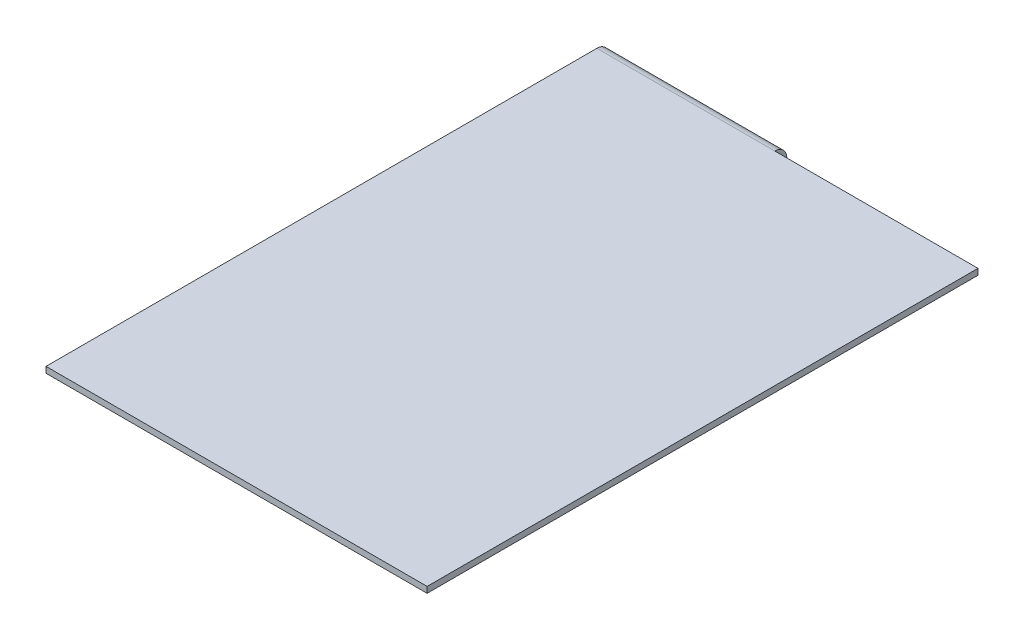
ISO-10303-21;
HEADER;
FILE_DESCRIPTION(('STEP AP214'),'2;1');
FILE_NAME('part.step','',(''),(''),'','','');
FILE_SCHEMA(('AUTOMOTIVE_DESIGN { 1 0 10303 214 1 1 1 1 }'));
ENDSEC;
DATA;
#1=APPLICATION_CONTEXT('core data for automotive mechanical design processes');
#2=APPLICATION_PROTOCOL_DEFINITION('international standard','automotive_design',2000,#1);
#3=PRODUCT_CONTEXT('',#1,'mechanical');
#4=PRODUCT('Part','Part','',(#3));
#5=PRODUCT_RELATED_PRODUCT_CATEGORY('part','',(#4));
#6=PRODUCT_DEFINITION_FORMATION('','',#4);
#7=PRODUCT_DEFINITION_CONTEXT('part definition',#1,'design');
#8=PRODUCT_DEFINITION('design','',#6,#7);
#9=PRODUCT_DEFINITION_SHAPE('','',#8);
#10=(LENGTH_UNIT() NAMED_UNIT(*) SI_UNIT(.MILLI.,.METRE.));
#11=(NAMED_UNIT(*) PLANE_ANGLE_UNIT() SI_UNIT($,.RADIAN.));
#12=(NAMED_UNIT(*) SI_UNIT($,.STERADIAN.) SOLID_ANGLE_UNIT());
#13=UNCERTAINTY_MEASURE_WITH_UNIT(LENGTH_MEASURE(1.E-05),#10,'distance_accuracy_value','');
#14=(GEOMETRIC_REPRESENTATION_CONTEXT(3) GLOBAL_UNCERTAINTY_ASSIGNED_CONTEXT((#13)) GLOBAL_UNIT_ASSIGNED_CONTEXT((#10,
#11,#12)) REPRESENTATION_CONTEXT('',''));
#15=CARTESIAN_POINT('',(0.,0.,0.));
#16=DIRECTION('',(0.,0.,1.));
#17=DIRECTION('',(1.,0.,0.));
#18=AXIS2_PLACEMENT_3D('',#15,#16,#17);
#19=CARTESIAN_POINT('',(0.,-3.175,-290.83));
#20=DIRECTION('',(0.,0.,-1.));
#21=DIRECTION('',(-1.,0.,0.));
#22=AXIS2_PLACEMENT_3D('',#19,#20,#21);
#23=PLANE('',#22);
#24=DIRECTION('',(-1.,0.,0.));
#25=VECTOR('',#24,1.);
#26=CARTESIAN_POINT('',(0.,-3.175,-290.83));
#27=LINE('',#26,#25);
#28=CARTESIAN_POINT('',(201.20864,-3.175,-290.83));
#29=VERTEX_POINT('',#28);
#30=CARTESIAN_POINT('',(93.921520056,-3.17500000000001,-290.83));
#31=VERTEX_POINT('',#30);
#32=EDGE_CURVE('E206',#29,#31,#27,.T.);
#33=ORIENTED_EDGE('',*,*,#32,.T.);
#34=DIRECTION('',(0.,1.,0.));
#35=VECTOR('',#34,1.);
#36=CARTESIAN_POINT('',(93.921520056,-3.17500000000001,-290.83));
#37=LINE('',#36,#35);
#38=CARTESIAN_POINT('',(93.921520056,0.,-290.83));
#39=VERTEX_POINT('',#38);
#40=EDGE_CURVE('E186',#31,#39,#37,.T.);
#41=ORIENTED_EDGE('',*,*,#40,.T.);
#42=DIRECTION('',(-1.,0.,0.));
#43=VECTOR('',#42,1.);
#44=CARTESIAN_POINT('',(0.,0.,-290.83));
#45=LINE('',#44,#43);
#46=CARTESIAN_POINT('',(201.20864,0.,-290.83));
#47=VERTEX_POINT('',#46);
#48=EDGE_CURVE('E202',#47,#39,#45,.T.);
#49=ORIENTED_EDGE('',*,*,#48,.F.);
#50=DIRECTION('',(0.,1.,0.));
#51=VECTOR('',#50,1.);
#52=CARTESIAN_POINT('',(201.20864,-3.175,-290.83));
#53=LINE('',#52,#51);
#54=EDGE_CURVE('E67',#29,#47,#53,.T.);
#55=ORIENTED_EDGE('',*,*,#54,.F.);
#56=EDGE_LOOP('',(#33,#41,#49,#55));
#57=FACE_BOUND('',#56,.T.);
#58=ADVANCED_FACE('F58',(#57),#23,.T.);
#59=CARTESIAN_POINT('',(0.,-3.175,0.));
#60=DIRECTION('',(-1.,0.,0.));
#61=DIRECTION('',(0.,0.,1.));
#62=AXIS2_PLACEMENT_3D('',#59,#60,#61);
#63=PLANE('',#62);
#64=DIRECTION('',(0.,0.,1.));
#65=VECTOR('',#64,1.);
#66=CARTESIAN_POINT('',(0.,0.,0.));
#67=LINE('',#66,#65);
#68=CARTESIAN_POINT('',(0.,0.,-290.83));
#69=VERTEX_POINT('',#68);
#70=CARTESIAN_POINT('',(0.,0.,0.));
#71=VERTEX_POINT('',#70);
#72=EDGE_CURVE('E197',#69,#71,#67,.T.);
#73=ORIENTED_EDGE('',*,*,#72,.F.);
#74=DIRECTION('',(0.,1.,0.));
#75=VECTOR('',#74,1.);
#76=CARTESIAN_POINT('',(0.,-3.175,-290.83));
#77=LINE('',#76,#75);
#78=CARTESIAN_POINT('',(0.,-3.17500000000001,-290.83));
#79=VERTEX_POINT('',#78);
#80=EDGE_CURVE('E13',#79,#69,#77,.T.);
#81=ORIENTED_EDGE('',*,*,#80,.F.);
#82=DIRECTION('',(0.,0.,1.));
#83=VECTOR('',#82,1.);
#84=CARTESIAN_POINT('',(0.,-3.175,0.));
#85=LINE('',#84,#83);
#86=CARTESIAN_POINT('',(0.,-3.175,0.));
#87=VERTEX_POINT('',#86);
#88=EDGE_CURVE('E198',#79,#87,#85,.T.);
#89=ORIENTED_EDGE('',*,*,#88,.T.);
#90=DIRECTION('',(0.,1.,0.));
#91=VECTOR('',#90,1.);
#92=CARTESIAN_POINT('',(0.,-3.175,0.));
#93=LINE('',#92,#91);
#94=EDGE_CURVE('E62',#87,#71,#93,.T.);
#95=ORIENTED_EDGE('',*,*,#94,.T.);
#96=EDGE_LOOP('',(#73,#81,#89,#95));
#97=FACE_BOUND('',#96,.T.);
#98=ADVANCED_FACE('F60',(#97),#63,.T.);
#99=CARTESIAN_POINT('',(201.20864,-3.175,0.));
#100=DIRECTION('',(1.,0.,0.));
#101=DIRECTION('',(0.,0.,-1.));
#102=AXIS2_PLACEMENT_3D('',#99,#100,#101);
#103=PLANE('',#102);
#104=DIRECTION('',(0.,0.,-1.));
#105=VECTOR('',#104,1.);
#106=CARTESIAN_POINT('',(201.20864,0.,0.));
#107=LINE('',#106,#105);
#108=CARTESIAN_POINT('',(201.20864,0.,0.));
#109=VERTEX_POINT('',#108);
#110=EDGE_CURVE('E213',#109,#47,#107,.T.);
#111=ORIENTED_EDGE('',*,*,#110,.F.);
#112=DIRECTION('',(0.,1.,0.));
#113=VECTOR('',#112,1.);
#114=CARTESIAN_POINT('',(201.20864,-3.175,0.));
#115=LINE('',#114,#113);
#116=CARTESIAN_POINT('',(201.20864,-3.175,0.));
#117=VERTEX_POINT('',#116);
#118=EDGE_CURVE('E217',#117,#109,#115,.T.);
#119=ORIENTED_EDGE('',*,*,#118,.F.);
#120=DIRECTION('',(0.,0.,-1.));
#121=VECTOR('',#120,1.);
#122=CARTESIAN_POINT('',(201.20864,-3.175,0.));
#123=LINE('',#122,#121);
#124=EDGE_CURVE('E204',#117,#29,#123,.T.);
#125=ORIENTED_EDGE('',*,*,#124,.T.);
#126=ORIENTED_EDGE('',*,*,#54,.T.);
#127=EDGE_LOOP('',(#111,#119,#125,#126));
#128=FACE_BOUND('',#127,.T.);
#129=ADVANCED_FACE('F239',(#128),#103,.T.);
#130=CARTESIAN_POINT('',(0.,-3.175,0.));
#131=DIRECTION('',(0.,0.,1.));
#132=DIRECTION('',(1.,0.,0.));
#133=AXIS2_PLACEMENT_3D('',#130,#131,#132);
#134=PLANE('',#133);
#135=DIRECTION('',(1.,0.,0.));
#136=VECTOR('',#135,1.);
#137=CARTESIAN_POINT('',(0.,0.,0.));
#138=LINE('',#137,#136);
#139=EDGE_CURVE('E210',#71,#109,#138,.T.);
#140=ORIENTED_EDGE('',*,*,#139,.F.);
#141=ORIENTED_EDGE('',*,*,#94,.F.);
#142=DIRECTION('',(1.,0.,0.));
#143=VECTOR('',#142,1.);
#144=CARTESIAN_POINT('',(0.,-3.175,0.));
#145=LINE('',#144,#143);
#146=EDGE_CURVE('E201',#87,#117,#145,.T.);
#147=ORIENTED_EDGE('',*,*,#146,.T.);
#148=ORIENTED_EDGE('',*,*,#118,.T.);
#149=EDGE_LOOP('',(#140,#141,#147,#148));
#150=FACE_BOUND('',#149,.T.);
#151=ADVANCED_FACE('F222',(#150),#134,.T.);
#152=CARTESIAN_POINT('',(0.,-3.175,0.));
#153=DIRECTION('',(0.,-1.,0.));
#154=DIRECTION('',(0.,0.,-1.));
#155=AXIS2_PLACEMENT_3D('',#152,#153,#154);
#156=PLANE('',#155);
#157=ORIENTED_EDGE('',*,*,#88,.F.);
#158=DIRECTION('',(1.,0.,0.));
#159=VECTOR('',#158,1.);
#160=CARTESIAN_POINT('',(93.921520056,-3.17500000000001,-290.83));
#161=LINE('',#160,#159);
#162=EDGE_CURVE('E191',#31,#79,#161,.F.);
#163=ORIENTED_EDGE('',*,*,#162,.F.);
#164=ORIENTED_EDGE('',*,*,#32,.F.);
#165=ORIENTED_EDGE('',*,*,#124,.F.);
#166=ORIENTED_EDGE('',*,*,#146,.F.);
#167=EDGE_LOOP('',(#157,#163,#164,#165,#166));
#168=FACE_BOUND('',#167,.T.);
#169=ADVANCED_FACE('F237',(#168),#156,.T.);
#170=CARTESIAN_POINT('',(0.,0.,0.));
#171=DIRECTION('',(0.,-1.,0.));
#172=DIRECTION('',(0.,0.,-1.));
#173=AXIS2_PLACEMENT_3D('',#170,#171,#172);
#174=PLANE('',#173);
#175=ORIENTED_EDGE('',*,*,#72,.T.);
#176=ORIENTED_EDGE('',*,*,#139,.T.);
#177=ORIENTED_EDGE('',*,*,#110,.T.);
#178=ORIENTED_EDGE('',*,*,#48,.T.);
#179=DIRECTION('',(1.,0.,0.));
#180=VECTOR('',#179,1.);
#181=CARTESIAN_POINT('',(93.921520056,0.,-290.83));
#182=LINE('',#181,#180);
#183=EDGE_CURVE('E180',#39,#69,#182,.F.);
#184=ORIENTED_EDGE('',*,*,#183,.T.);
#185=EDGE_LOOP('',(#175,#176,#177,#178,#184));
#186=FACE_BOUND('',#185,.T.);
#187=ADVANCED_FACE('F224',(#186),#174,.F.);
#188=CARTESIAN_POINT('',(0.,-6.34999999999999,-290.83));
#189=DIRECTION('',(-1.,0.,0.));
#190=DIRECTION('',(0.,0.,1.));
#191=AXIS2_PLACEMENT_3D('',#188,#189,#190);
#192=PLANE('',#191);
#193=DIRECTION('',(0.,0.,-1.));
#194=VECTOR('',#193,1.);
#195=CARTESIAN_POINT('',(0.,-6.34999999999995,-297.18));
#196=LINE('',#195,#194);
#197=CARTESIAN_POINT('',(0.,-6.34999999999998,-294.005));
#198=VERTEX_POINT('',#197);
#199=CARTESIAN_POINT('',(0.,-6.34999999999997,-297.18));
#200=VERTEX_POINT('',#199);
#201=EDGE_CURVE('E177',#198,#200,#196,.T.);
#202=ORIENTED_EDGE('',*,*,#201,.F.);
#203=CARTESIAN_POINT('',(0.,-6.34999999999999,-290.83));
#204=DIRECTION('',(1.,0.,0.));
#205=DIRECTION('',(0.,0.,-1.));
#206=AXIS2_PLACEMENT_3D('',#203,#204,#205);
#207=CIRCLE('',#206,3.17499999999998);
#208=EDGE_CURVE('E188',#79,#198,#207,.F.);
#209=ORIENTED_EDGE('',*,*,#208,.F.);
#210=ORIENTED_EDGE('',*,*,#80,.T.);
#211=CARTESIAN_POINT('',(0.,-6.34999999999999,-290.83));
#212=DIRECTION('',(1.,0.,0.));
#213=DIRECTION('',(0.,0.,-1.));
#214=AXIS2_PLACEMENT_3D('',#211,#212,#213);
#215=CIRCLE('',#214,6.34999999999998);
#216=EDGE_CURVE('E183',#69,#200,#215,.F.);
#217=ORIENTED_EDGE('',*,*,#216,.T.);
#218=EDGE_LOOP('',(#202,#209,#210,#217));
#219=FACE_BOUND('',#218,.T.);
#220=ADVANCED_FACE('F253',(#219),#192,.T.);
#221=CARTESIAN_POINT('',(93.921520056,-6.34999999999999,-290.83));
#222=DIRECTION('',(-1.,0.,0.));
#223=DIRECTION('',(0.,0.,1.));
#224=AXIS2_PLACEMENT_3D('',#221,#222,#223);
#225=PLANE('',#224);
#226=CARTESIAN_POINT('',(93.921520056,-6.34999999999999,-290.83));
#227=DIRECTION('',(1.,0.,0.));
#228=DIRECTION('',(0.,0.,-1.));
#229=AXIS2_PLACEMENT_3D('',#226,#227,#228);
#230=CIRCLE('',#229,3.17499999999998);
#231=CARTESIAN_POINT('',(93.921520056,-6.34999999999998,-294.005));
#232=VERTEX_POINT('',#231);
#233=EDGE_CURVE('E148',#232,#31,#230,.T.);
#234=ORIENTED_EDGE('',*,*,#233,.F.);
#235=DIRECTION('',(0.,0.,-1.));
#236=VECTOR('',#235,1.);
#237=CARTESIAN_POINT('',(93.921520056,-6.34999999999997,-294.005));
#238=LINE('',#237,#236);
#239=CARTESIAN_POINT('',(93.921520056,-6.34999999999994,-297.18));
#240=VERTEX_POINT('',#239);
#241=EDGE_CURVE('E173',#232,#240,#238,.T.);
#242=ORIENTED_EDGE('',*,*,#241,.T.);
#243=CARTESIAN_POINT('',(93.921520056,-6.34999999999999,-290.83));
#244=DIRECTION('',(1.,0.,0.));
#245=DIRECTION('',(0.,0.,-1.));
#246=AXIS2_PLACEMENT_3D('',#243,#244,#245);
#247=CIRCLE('',#246,6.34999999999998);
#248=EDGE_CURVE('E75',#240,#39,#247,.T.);
#249=ORIENTED_EDGE('',*,*,#248,.T.);
#250=ORIENTED_EDGE('',*,*,#40,.F.);
#251=EDGE_LOOP('',(#234,#242,#249,#250));
#252=FACE_BOUND('',#251,.T.);
#253=ADVANCED_FACE('F230',(#252),#225,.F.);
#254=CARTESIAN_POINT('',(93.921520056,-6.34999999999999,-290.83));
#255=DIRECTION('',(1.,0.,0.));
#256=DIRECTION('',(0.,0.,-1.));
#257=AXIS2_PLACEMENT_3D('',#254,#255,#256);
#258=CYLINDRICAL_SURFACE('',#257,6.34999999999998);
#259=ORIENTED_EDGE('',*,*,#183,.F.);
#260=ORIENTED_EDGE('',*,*,#248,.F.);
#261=DIRECTION('',(1.,0.,0.));
#262=VECTOR('',#261,1.);
#263=CARTESIAN_POINT('',(0.,-6.34999999999994,-297.18));
#264=LINE('',#263,#262);
#265=EDGE_CURVE('E162',#240,#200,#264,.F.);
#266=ORIENTED_EDGE('',*,*,#265,.T.);
#267=ORIENTED_EDGE('',*,*,#216,.F.);
#268=EDGE_LOOP('',(#259,#260,#266,#267));
#269=FACE_BOUND('',#268,.T.);
#270=ADVANCED_FACE('F227',(#269),#258,.T.);
#271=CARTESIAN_POINT('',(93.921520056,-6.34999999999999,-290.83));
#272=DIRECTION('',(1.,0.,0.));
#273=DIRECTION('',(0.,0.,-1.));
#274=AXIS2_PLACEMENT_3D('',#271,#272,#273);
#275=CYLINDRICAL_SURFACE('',#274,3.17499999999998);
#276=ORIENTED_EDGE('',*,*,#162,.T.);
#277=ORIENTED_EDGE('',*,*,#208,.T.);
#278=DIRECTION('',(1.,0.,0.));
#279=VECTOR('',#278,1.);
#280=CARTESIAN_POINT('',(0.,-6.34999999999997,-294.005));
#281=LINE('',#280,#279);
#282=EDGE_CURVE('E175',#198,#232,#281,.T.);
#283=ORIENTED_EDGE('',*,*,#282,.T.);
#284=ORIENTED_EDGE('',*,*,#233,.T.);
#285=EDGE_LOOP('',(#276,#277,#283,#284));
#286=FACE_BOUND('',#285,.T.);
#287=ADVANCED_FACE('F233',(#286),#275,.F.);
#288=CARTESIAN_POINT('',(93.921520056,-38.1,-297.18));
#289=DIRECTION('',(1.,0.,0.));
#290=DIRECTION('',(0.,0.,-1.));
#291=AXIS2_PLACEMENT_3D('',#288,#289,#290);
#292=PLANE('',#291);
#293=DIRECTION('',(0.,-1.,0.));
#294=VECTOR('',#293,1.);
#295=CARTESIAN_POINT('',(93.921520056,-38.1,-297.18));
#296=LINE('',#295,#294);
#297=CARTESIAN_POINT('',(93.921520056,-38.1,-297.18));
#298=VERTEX_POINT('',#297);
#299=EDGE_CURVE('E142',#298,#240,#296,.F.);
#300=ORIENTED_EDGE('',*,*,#299,.T.);
#301=ORIENTED_EDGE('',*,*,#241,.F.);
#302=DIRECTION('',(0.,1.,0.));
#303=VECTOR('',#302,1.);
#304=CARTESIAN_POINT('',(93.921520056,9.2451299141513E-13,-294.005));
#305=LINE('',#304,#303);
#306=CARTESIAN_POINT('',(93.921520056,-38.1,-294.005));
#307=VERTEX_POINT('',#306);
#308=EDGE_CURVE('E144',#307,#232,#305,.T.);
#309=ORIENTED_EDGE('',*,*,#308,.F.);
#310=DIRECTION('',(0.,0.,1.));
#311=VECTOR('',#310,1.);
#312=CARTESIAN_POINT('',(93.921520056,-38.1,-297.18));
#313=LINE('',#312,#311);
#314=EDGE_CURVE('E137',#298,#307,#313,.T.);
#315=ORIENTED_EDGE('',*,*,#314,.F.);
#316=EDGE_LOOP('',(#300,#301,#309,#315));
#317=FACE_BOUND('',#316,.T.);
#318=ADVANCED_FACE('F139',(#317),#292,.T.);
#319=CARTESIAN_POINT('',(0.,-38.1,-297.18));
#320=DIRECTION('',(-1.,0.,0.));
#321=DIRECTION('',(0.,0.,1.));
#322=AXIS2_PLACEMENT_3D('',#319,#320,#321);
#323=PLANE('',#322);
#324=DIRECTION('',(0.,-1.,0.));
#325=VECTOR('',#324,1.);
#326=CARTESIAN_POINT('',(0.,9.2451299141513E-13,-294.005));
#327=LINE('',#326,#325);
#328=CARTESIAN_POINT('',(0.,-38.1,-294.005));
#329=VERTEX_POINT('',#328);
#330=EDGE_CURVE('E170',#198,#329,#327,.T.);
#331=ORIENTED_EDGE('',*,*,#330,.F.);
#332=ORIENTED_EDGE('',*,*,#201,.T.);
#333=DIRECTION('',(0.,1.,0.));
#334=VECTOR('',#333,1.);
#335=CARTESIAN_POINT('',(0.,-38.1,-297.18));
#336=LINE('',#335,#334);
#337=CARTESIAN_POINT('',(0.,-38.1,-297.18));
#338=VERTEX_POINT('',#337);
#339=EDGE_CURVE('E158',#200,#338,#336,.F.);
#340=ORIENTED_EDGE('',*,*,#339,.T.);
#341=DIRECTION('',(0.,0.,1.));
#342=VECTOR('',#341,1.);
#343=CARTESIAN_POINT('',(0.,-38.1,-297.18));
#344=LINE('',#343,#342);
#345=EDGE_CURVE('E149',#338,#329,#344,.T.);
#346=ORIENTED_EDGE('',*,*,#345,.T.);
#347=EDGE_LOOP('',(#331,#332,#340,#346));
#348=FACE_BOUND('',#347,.T.);
#349=ADVANCED_FACE('F265',(#348),#323,.T.);
#350=CARTESIAN_POINT('',(0.,9.35598444665957E-13,-297.18));
#351=DIRECTION('',(0.,0.,1.));
#352=DIRECTION('',(0.,-1.,0.));
#353=AXIS2_PLACEMENT_3D('',#350,#351,#352);
#354=PLANE('',#353);
#355=ORIENTED_EDGE('',*,*,#265,.F.);
#356=ORIENTED_EDGE('',*,*,#299,.F.);
#357=DIRECTION('',(-1.,0.,0.));
#358=VECTOR('',#357,1.);
#359=CARTESIAN_POINT('',(93.921520056,-38.1,-297.18));
#360=LINE('',#359,#358);
#361=EDGE_CURVE('E153',#338,#298,#360,.F.);
#362=ORIENTED_EDGE('',*,*,#361,.F.);
#363=ORIENTED_EDGE('',*,*,#339,.F.);
#364=EDGE_LOOP('',(#355,#356,#362,#363));
#365=FACE_BOUND('',#364,.T.);
#366=ADVANCED_FACE('F161',(#365),#354,.F.);
#367=CARTESIAN_POINT('',(0.,9.2451299141513E-13,-294.005));
#368=DIRECTION('',(0.,0.,1.));
#369=DIRECTION('',(0.,-1.,0.));
#370=AXIS2_PLACEMENT_3D('',#367,#368,#369);
#371=PLANE('',#370);
#372=ORIENTED_EDGE('',*,*,#308,.T.);
#373=ORIENTED_EDGE('',*,*,#282,.F.);
#374=ORIENTED_EDGE('',*,*,#330,.T.);
#375=DIRECTION('',(1.,0.,0.));
#376=VECTOR('',#375,1.);
#377=CARTESIAN_POINT('',(0.,-38.1,-294.005));
#378=LINE('',#377,#376);
#379=EDGE_CURVE('E168',#329,#307,#378,.T.);
#380=ORIENTED_EDGE('',*,*,#379,.T.);
#381=EDGE_LOOP('',(#372,#373,#374,#380));
#382=FACE_BOUND('',#381,.T.);
#383=ADVANCED_FACE('F271',(#382),#371,.T.);
#384=CARTESIAN_POINT('',(93.921520056,-38.1,-297.18));
#385=DIRECTION('',(0.,-1.,0.));
#386=DIRECTION('',(0.,0.,-1.));
#387=AXIS2_PLACEMENT_3D('',#384,#385,#386);
#388=PLANE('',#387);
#389=ORIENTED_EDGE('',*,*,#379,.F.);
#390=ORIENTED_EDGE('',*,*,#345,.F.);
#391=ORIENTED_EDGE('',*,*,#361,.T.);
#392=ORIENTED_EDGE('',*,*,#314,.T.);
#393=EDGE_LOOP('',(#389,#390,#391,#392));
#394=FACE_BOUND('',#393,.T.);
#395=ADVANCED_FACE('F154',(#394),#388,.T.);
#396=CLOSED_SHELL('',(#58,#98,#129,#151,#169,#187,#220,#253,#270,#287,#318,#349,#366,#383,#395));
#397=MANIFOLD_SOLID_BREP('B2',#396);
#398=ADVANCED_BREP_SHAPE_REPRESENTATION('',(#18,#397),#14);
#399=SHAPE_DEFINITION_REPRESENTATION(#9,#398);
ENDSEC;
END-ISO-10303-21;
